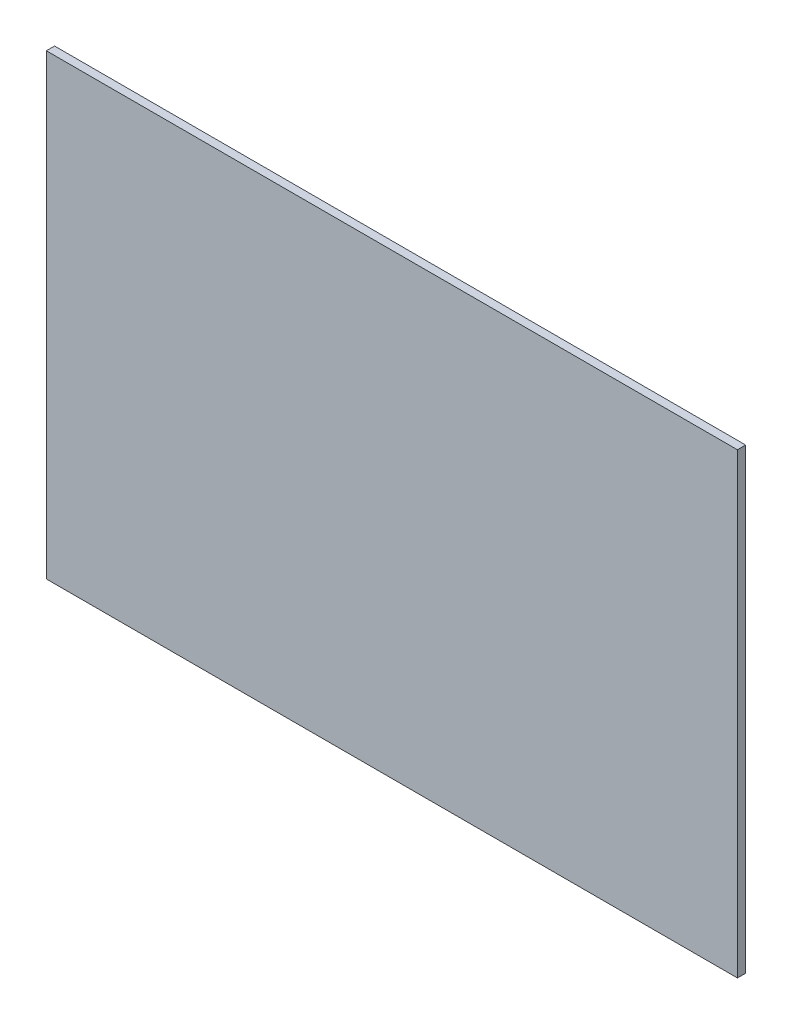
ISO-10303-21;
HEADER;
FILE_DESCRIPTION(('STEP AP214'),'2;1');
FILE_NAME('part.step','',(''),(''),'','','');
FILE_SCHEMA(('AUTOMOTIVE_DESIGN { 1 0 10303 214 1 1 1 1 }'));
ENDSEC;
DATA;
#1=APPLICATION_CONTEXT('core data for automotive mechanical design processes');
#2=APPLICATION_PROTOCOL_DEFINITION('international standard','automotive_design',2000,#1);
#3=PRODUCT_CONTEXT('',#1,'mechanical');
#4=PRODUCT('Part','Part','',(#3));
#5=PRODUCT_RELATED_PRODUCT_CATEGORY('part','',(#4));
#6=PRODUCT_DEFINITION_FORMATION('','',#4);
#7=PRODUCT_DEFINITION_CONTEXT('part definition',#1,'design');
#8=PRODUCT_DEFINITION('design','',#6,#7);
#9=PRODUCT_DEFINITION_SHAPE('','',#8);
#10=(LENGTH_UNIT() NAMED_UNIT(*) SI_UNIT(.MILLI.,.METRE.));
#11=(NAMED_UNIT(*) PLANE_ANGLE_UNIT() SI_UNIT($,.RADIAN.));
#12=(NAMED_UNIT(*) SI_UNIT($,.STERADIAN.) SOLID_ANGLE_UNIT());
#13=UNCERTAINTY_MEASURE_WITH_UNIT(LENGTH_MEASURE(1.E-05),#10,'distance_accuracy_value','');
#14=(GEOMETRIC_REPRESENTATION_CONTEXT(3) GLOBAL_UNCERTAINTY_ASSIGNED_CONTEXT((#13)) GLOBAL_UNIT_ASSIGNED_CONTEXT((#10,
#11,#12)) REPRESENTATION_CONTEXT('',''));
#15=CARTESIAN_POINT('',(0.,0.,0.));
#16=DIRECTION('',(0.,0.,1.));
#17=DIRECTION('',(1.,0.,0.));
#18=AXIS2_PLACEMENT_3D('',#15,#16,#17);
#19=CARTESIAN_POINT('',(210.,139.,5.));
#20=DIRECTION('',(-1.,0.,0.));
#21=DIRECTION('',(0.,-1.,0.));
#22=AXIS2_PLACEMENT_3D('',#19,#20,#21);
#23=PLANE('',#22);
#24=DIRECTION('',(0.,1.,0.));
#25=VECTOR('',#24,1.);
#26=CARTESIAN_POINT('',(210.,139.,0.));
#27=LINE('',#26,#25);
#28=CARTESIAN_POINT('',(210.,-139.,0.));
#29=VERTEX_POINT('',#28);
#30=CARTESIAN_POINT('',(210.,139.,0.));
#31=VERTEX_POINT('',#30);
#32=EDGE_CURVE('E107',#29,#31,#27,.T.);
#33=ORIENTED_EDGE('',*,*,#32,.T.);
#34=DIRECTION('',(0.,0.,-1.));
#35=VECTOR('',#34,1.);
#36=CARTESIAN_POINT('',(210.,139.,5.));
#37=LINE('',#36,#35);
#38=CARTESIAN_POINT('',(210.,139.,5.));
#39=VERTEX_POINT('',#38);
#40=EDGE_CURVE('E11',#39,#31,#37,.T.);
#41=ORIENTED_EDGE('',*,*,#40,.F.);
#42=DIRECTION('',(0.,1.,0.));
#43=VECTOR('',#42,1.);
#44=CARTESIAN_POINT('',(210.,139.,5.));
#45=LINE('',#44,#43);
#46=CARTESIAN_POINT('',(210.,-139.,5.));
#47=VERTEX_POINT('',#46);
#48=EDGE_CURVE('E91',#47,#39,#45,.T.);
#49=ORIENTED_EDGE('',*,*,#48,.F.);
#50=DIRECTION('',(0.,0.,-1.));
#51=VECTOR('',#50,1.);
#52=CARTESIAN_POINT('',(210.,-139.,5.));
#53=LINE('',#52,#51);
#54=EDGE_CURVE('E103',#47,#29,#53,.T.);
#55=ORIENTED_EDGE('',*,*,#54,.T.);
#56=EDGE_LOOP('',(#33,#41,#49,#55));
#57=FACE_BOUND('',#56,.T.);
#58=ADVANCED_FACE('F39',(#57),#23,.F.);
#59=CARTESIAN_POINT('',(-210.,139.,5.));
#60=DIRECTION('',(0.,-1.,0.));
#61=DIRECTION('',(0.,0.,-1.));
#62=AXIS2_PLACEMENT_3D('',#59,#60,#61);
#63=PLANE('',#62);
#64=DIRECTION('',(-1.,0.,0.));
#65=VECTOR('',#64,1.);
#66=CARTESIAN_POINT('',(-210.,139.,0.));
#67=LINE('',#66,#65);
#68=CARTESIAN_POINT('',(-210.,139.,0.));
#69=VERTEX_POINT('',#68);
#70=EDGE_CURVE('E96',#31,#69,#67,.T.);
#71=ORIENTED_EDGE('',*,*,#70,.T.);
#72=DIRECTION('',(0.,0.,-1.));
#73=VECTOR('',#72,1.);
#74=CARTESIAN_POINT('',(-210.,139.,5.));
#75=LINE('',#74,#73);
#76=CARTESIAN_POINT('',(-210.,139.,5.));
#77=VERTEX_POINT('',#76);
#78=EDGE_CURVE('E48',#77,#69,#75,.T.);
#79=ORIENTED_EDGE('',*,*,#78,.F.);
#80=DIRECTION('',(-1.,0.,0.));
#81=VECTOR('',#80,1.);
#82=CARTESIAN_POINT('',(-210.,139.,5.));
#83=LINE('',#82,#81);
#84=EDGE_CURVE('E86',#39,#77,#83,.T.);
#85=ORIENTED_EDGE('',*,*,#84,.F.);
#86=ORIENTED_EDGE('',*,*,#40,.T.);
#87=EDGE_LOOP('',(#71,#79,#85,#86));
#88=FACE_BOUND('',#87,.T.);
#89=ADVANCED_FACE('F95',(#88),#63,.F.);
#90=CARTESIAN_POINT('',(-210.,139.,5.));
#91=DIRECTION('',(1.,0.,0.));
#92=DIRECTION('',(0.,0.,-1.));
#93=AXIS2_PLACEMENT_3D('',#90,#91,#92);
#94=PLANE('',#93);
#95=DIRECTION('',(0.,-1.,0.));
#96=VECTOR('',#95,1.);
#97=CARTESIAN_POINT('',(-210.,139.,0.));
#98=LINE('',#97,#96);
#99=CARTESIAN_POINT('',(-210.,-139.,0.));
#100=VERTEX_POINT('',#99);
#101=EDGE_CURVE('E73',#69,#100,#98,.T.);
#102=ORIENTED_EDGE('',*,*,#101,.T.);
#103=DIRECTION('',(0.,0.,-1.));
#104=VECTOR('',#103,1.);
#105=CARTESIAN_POINT('',(-210.,-139.,5.));
#106=LINE('',#105,#104);
#107=CARTESIAN_POINT('',(-210.,-139.,5.));
#108=VERTEX_POINT('',#107);
#109=EDGE_CURVE('E98',#108,#100,#106,.T.);
#110=ORIENTED_EDGE('',*,*,#109,.F.);
#111=DIRECTION('',(0.,-1.,0.));
#112=VECTOR('',#111,1.);
#113=CARTESIAN_POINT('',(-210.,139.,5.));
#114=LINE('',#113,#112);
#115=EDGE_CURVE('E89',#77,#108,#114,.T.);
#116=ORIENTED_EDGE('',*,*,#115,.F.);
#117=ORIENTED_EDGE('',*,*,#78,.T.);
#118=EDGE_LOOP('',(#102,#110,#116,#117));
#119=FACE_BOUND('',#118,.T.);
#120=ADVANCED_FACE('F99',(#119),#94,.F.);
#121=CARTESIAN_POINT('',(-210.,-139.,5.));
#122=DIRECTION('',(0.,1.,0.));
#123=DIRECTION('',(0.,0.,1.));
#124=AXIS2_PLACEMENT_3D('',#121,#122,#123);
#125=PLANE('',#124);
#126=DIRECTION('',(1.,0.,0.));
#127=VECTOR('',#126,1.);
#128=CARTESIAN_POINT('',(-210.,-139.,0.));
#129=LINE('',#128,#127);
#130=EDGE_CURVE('E79',#100,#29,#129,.T.);
#131=ORIENTED_EDGE('',*,*,#130,.T.);
#132=ORIENTED_EDGE('',*,*,#54,.F.);
#133=DIRECTION('',(1.,0.,0.));
#134=VECTOR('',#133,1.);
#135=CARTESIAN_POINT('',(-210.,-139.,5.));
#136=LINE('',#135,#134);
#137=EDGE_CURVE('E56',#108,#47,#136,.T.);
#138=ORIENTED_EDGE('',*,*,#137,.F.);
#139=ORIENTED_EDGE('',*,*,#109,.T.);
#140=EDGE_LOOP('',(#131,#132,#138,#139));
#141=FACE_BOUND('',#140,.T.);
#142=ADVANCED_FACE('F120',(#141),#125,.F.);
#143=CARTESIAN_POINT('',(0.,0.,5.));
#144=DIRECTION('',(0.,0.,1.));
#145=DIRECTION('',(1.,0.,0.));
#146=AXIS2_PLACEMENT_3D('',#143,#144,#145);
#147=PLANE('',#146);
#148=ORIENTED_EDGE('',*,*,#48,.T.);
#149=ORIENTED_EDGE('',*,*,#84,.T.);
#150=ORIENTED_EDGE('',*,*,#115,.T.);
#151=ORIENTED_EDGE('',*,*,#137,.T.);
#152=EDGE_LOOP('',(#148,#149,#150,#151));
#153=FACE_BOUND('',#152,.T.);
#154=ADVANCED_FACE('F87',(#153),#147,.T.);
#155=CARTESIAN_POINT('',(0.,0.,0.));
#156=DIRECTION('',(0.,0.,1.));
#157=DIRECTION('',(1.,0.,0.));
#158=AXIS2_PLACEMENT_3D('',#155,#156,#157);
#159=PLANE('',#158);
#160=ORIENTED_EDGE('',*,*,#32,.F.);
#161=ORIENTED_EDGE('',*,*,#130,.F.);
#162=ORIENTED_EDGE('',*,*,#101,.F.);
#163=ORIENTED_EDGE('',*,*,#70,.F.);
#164=EDGE_LOOP('',(#160,#161,#162,#163));
#165=FACE_BOUND('',#164,.T.);
#166=ADVANCED_FACE('F123',(#165),#159,.F.);
#167=CLOSED_SHELL('',(#58,#89,#120,#142,#154,#166));
#168=MANIFOLD_SOLID_BREP('B2',#167);
#169=ADVANCED_BREP_SHAPE_REPRESENTATION('',(#18,#168),#14);
#170=SHAPE_DEFINITION_REPRESENTATION(#9,#169);
ENDSEC;
END-ISO-10303-21;
